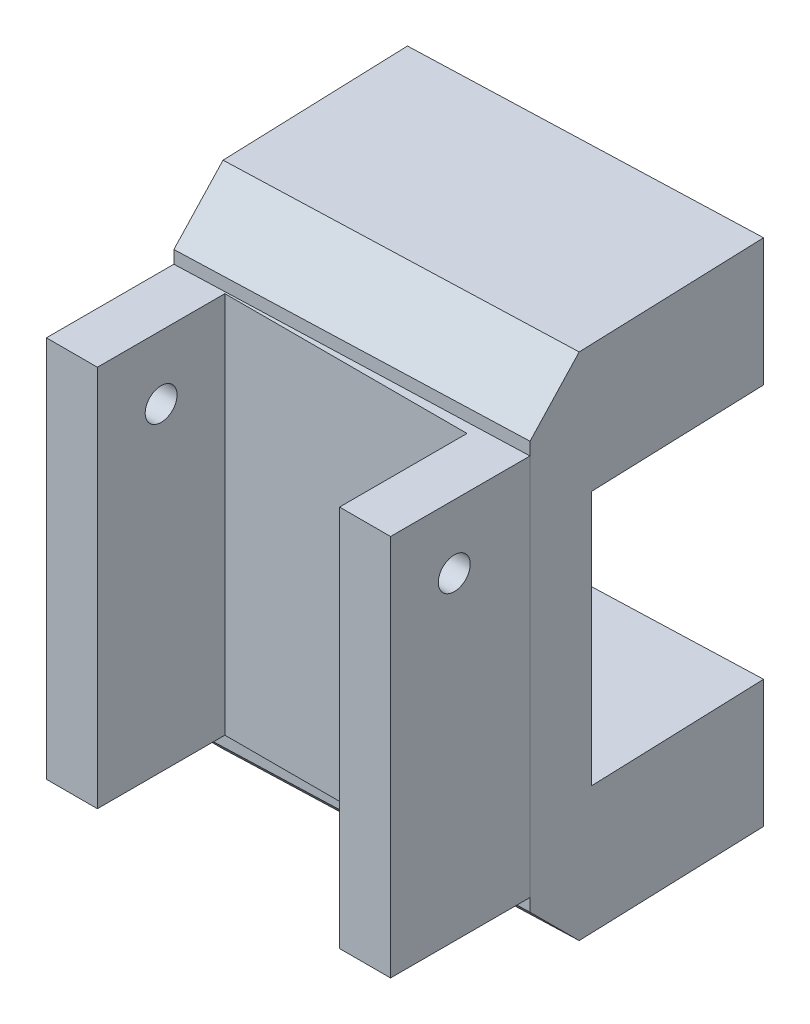
ISO-10303-21;
HEADER;
FILE_DESCRIPTION(('STEP AP214'),'2;1');
FILE_NAME('part.step','',(''),(''),'','','');
FILE_SCHEMA(('AUTOMOTIVE_DESIGN { 1 0 10303 214 1 1 1 1 }'));
ENDSEC;
DATA;
#1=APPLICATION_CONTEXT('core data for automotive mechanical design processes');
#2=APPLICATION_PROTOCOL_DEFINITION('international standard','automotive_design',2000,#1);
#3=PRODUCT_CONTEXT('',#1,'mechanical');
#4=PRODUCT('Part','Part','',(#3));
#5=PRODUCT_RELATED_PRODUCT_CATEGORY('part','',(#4));
#6=PRODUCT_DEFINITION_FORMATION('','',#4);
#7=PRODUCT_DEFINITION_CONTEXT('part definition',#1,'design');
#8=PRODUCT_DEFINITION('design','',#6,#7);
#9=PRODUCT_DEFINITION_SHAPE('','',#8);
#10=(LENGTH_UNIT() NAMED_UNIT(*) SI_UNIT(.MILLI.,.METRE.));
#11=(NAMED_UNIT(*) PLANE_ANGLE_UNIT() SI_UNIT($,.RADIAN.));
#12=(NAMED_UNIT(*) SI_UNIT($,.STERADIAN.) SOLID_ANGLE_UNIT());
#13=UNCERTAINTY_MEASURE_WITH_UNIT(LENGTH_MEASURE(1.E-05),#10,'distance_accuracy_value','');
#14=(GEOMETRIC_REPRESENTATION_CONTEXT(3) GLOBAL_UNCERTAINTY_ASSIGNED_CONTEXT((#13)) GLOBAL_UNIT_ASSIGNED_CONTEXT((#10,
#11,#12)) REPRESENTATION_CONTEXT('',''));
#15=CARTESIAN_POINT('',(0.,0.,0.));
#16=DIRECTION('',(0.,0.,1.));
#17=DIRECTION('',(1.,0.,0.));
#18=AXIS2_PLACEMENT_3D('',#15,#16,#17);
#19=CARTESIAN_POINT('',(8.46169409796958,9.525,-6.94678246872153));
#20=DIRECTION('',(0.0348994967024939,0.,0.999390827019096));
#21=DIRECTION('',(0.999390827019096,0.,-0.0348994967024939));
#22=AXIS2_PLACEMENT_3D('',#19,#20,#21);
#23=PLANE('',#22);
#24=DIRECTION('',(0.,-1.,0.));
#25=VECTOR('',#24,1.);
#26=CARTESIAN_POINT('',(8.46169409796958,9.525,-6.94678246872153));
#27=LINE('',#26,#25);
#28=CARTESIAN_POINT('',(8.46169409796958,6.35,-6.94678246872153));
#29=VERTEX_POINT('',#28);
#30=CARTESIAN_POINT('',(8.46169409796958,-6.35,-6.94678246872153));
#31=VERTEX_POINT('',#30);
#32=EDGE_CURVE('E605',#29,#31,#27,.T.);
#33=ORIENTED_EDGE('',*,*,#32,.T.);
#34=DIRECTION('',(-0.999390827019096,0.,0.0348994967024939));
#35=VECTOR('',#34,1.);
#36=CARTESIAN_POINT('',(8.46169409796958,-6.35,-6.94678246872153));
#37=LINE('',#36,#35);
#38=CARTESIAN_POINT('',(-8.68330590203042,-6.35,-6.34806587578563));
#39=VERTEX_POINT('',#38);
#40=EDGE_CURVE('E512',#31,#39,#37,.T.);
#41=ORIENTED_EDGE('',*,*,#40,.T.);
#42=DIRECTION('',(0.,-1.,0.));
#43=VECTOR('',#42,1.);
#44=CARTESIAN_POINT('',(-8.68330590203042,9.525,-6.34806587578563));
#45=LINE('',#44,#43);
#46=CARTESIAN_POINT('',(-8.68330590203042,6.35,-6.34806587578563));
#47=VERTEX_POINT('',#46);
#48=EDGE_CURVE('E630',#47,#39,#45,.T.);
#49=ORIENTED_EDGE('',*,*,#48,.F.);
#50=DIRECTION('',(0.999390827019096,0.,-0.0348994967024939));
#51=VECTOR('',#50,1.);
#52=CARTESIAN_POINT('',(8.46169409796958,6.35,-6.94678246872153));
#53=LINE('',#52,#51);
#54=EDGE_CURVE('E561',#47,#29,#53,.T.);
#55=ORIENTED_EDGE('',*,*,#54,.T.);
#56=EDGE_LOOP('',(#33,#41,#49,#55));
#57=FACE_BOUND('',#56,.T.);
#58=ADVANCED_FACE('F372',(#57),#23,.F.);
#59=CARTESIAN_POINT('',(-8.68330590203042,9.525,-6.34806587578563));
#60=DIRECTION('',(0.999390827019096,0.,-0.0348994967024937));
#61=DIRECTION('',(-0.0348994967024937,0.,-0.999390827019096));
#62=AXIS2_PLACEMENT_3D('',#59,#60,#61);
#63=PLANE('',#62);
#64=DIRECTION('',(0.0348994967024937,0.,0.999390827019096));
#65=VECTOR('',#64,1.);
#66=CARTESIAN_POINT('',(-8.99356242771559,-12.7,-15.2326503279854));
#67=LINE('',#66,#65);
#68=CARTESIAN_POINT('',(-8.99356242771559,-12.7,-15.2326503279854));
#69=VERTEX_POINT('',#68);
#70=CARTESIAN_POINT('',(-8.66114472162434,-12.7,-5.71345270062849));
#71=VERTEX_POINT('',#70);
#72=EDGE_CURVE('E671',#69,#71,#67,.T.);
#73=ORIENTED_EDGE('',*,*,#72,.T.);
#74=DIRECTION('',(-0.0246776707783308,-0.707106781186549,-0.706676030840833));
#75=VECTOR('',#74,1.);
#76=CARTESIAN_POINT('',(-8.5725,-10.16,-3.17499999999998));
#77=LINE('',#76,#75);
#78=CARTESIAN_POINT('',(-8.5725,-10.16,-3.17499999999999));
#79=VERTEX_POINT('',#78);
#80=EDGE_CURVE('E649',#71,#79,#77,.F.);
#81=ORIENTED_EDGE('',*,*,#80,.T.);
#82=DIRECTION('',(0.,1.,0.));
#83=VECTOR('',#82,1.);
#84=CARTESIAN_POINT('',(-8.5725,-6.35,-3.17499999999999));
#85=LINE('',#84,#83);
#86=CARTESIAN_POINT('',(-8.5725,-9.525,-3.175));
#87=VERTEX_POINT('',#86);
#88=EDGE_CURVE('E532',#79,#87,#85,.T.);
#89=ORIENTED_EDGE('',*,*,#88,.T.);
#90=DIRECTION('',(0.,-1.,0.));
#91=VECTOR('',#90,1.);
#92=CARTESIAN_POINT('',(-8.5725,9.525,-3.175));
#93=LINE('',#92,#91);
#94=CARTESIAN_POINT('',(-8.5725,9.525,-3.17499999999999));
#95=VERTEX_POINT('',#94);
#96=EDGE_CURVE('E627',#95,#87,#93,.T.);
#97=ORIENTED_EDGE('',*,*,#96,.F.);
#98=DIRECTION('',(0.,1.,0.));
#99=VECTOR('',#98,1.);
#100=CARTESIAN_POINT('',(-8.5725,12.7,-3.17499999999999));
#101=LINE('',#100,#99);
#102=CARTESIAN_POINT('',(-8.5725,10.16,-3.17499999999999));
#103=VERTEX_POINT('',#102);
#104=EDGE_CURVE('E538',#95,#103,#101,.T.);
#105=ORIENTED_EDGE('',*,*,#104,.T.);
#106=DIRECTION('',(0.0246776707783309,-0.707106781186547,0.706676030840836));
#107=VECTOR('',#106,1.);
#108=CARTESIAN_POINT('',(-8.66114472162434,12.7,-5.71345270062849));
#109=LINE('',#108,#107);
#110=CARTESIAN_POINT('',(-8.66114472162434,12.7,-5.7134527006285));
#111=VERTEX_POINT('',#110);
#112=EDGE_CURVE('E386',#103,#111,#109,.F.);
#113=ORIENTED_EDGE('',*,*,#112,.T.);
#114=DIRECTION('',(-0.0348994967024937,0.,-0.999390827019096));
#115=VECTOR('',#114,1.);
#116=CARTESIAN_POINT('',(-8.99356242771559,12.7,-15.2326503279854));
#117=LINE('',#116,#115);
#118=CARTESIAN_POINT('',(-8.99356242771559,12.7,-15.2326503279854));
#119=VERTEX_POINT('',#118);
#120=EDGE_CURVE('E546',#111,#119,#117,.T.);
#121=ORIENTED_EDGE('',*,*,#120,.T.);
#122=DIRECTION('',(0.,-1.,0.));
#123=VECTOR('',#122,1.);
#124=CARTESIAN_POINT('',(-8.99356242771559,12.7,-15.2326503279854));
#125=LINE('',#124,#123);
#126=CARTESIAN_POINT('',(-8.99356242771559,6.35,-15.2326503279854));
#127=VERTEX_POINT('',#126);
#128=EDGE_CURVE('E544',#119,#127,#125,.T.);
#129=ORIENTED_EDGE('',*,*,#128,.T.);
#130=DIRECTION('',(0.0348994967024937,0.,0.999390827019096));
#131=VECTOR('',#130,1.);
#132=CARTESIAN_POINT('',(-8.99356242771559,6.35,-15.2326503279854));
#133=LINE('',#132,#131);
#134=EDGE_CURVE('E540',#127,#47,#133,.T.);
#135=ORIENTED_EDGE('',*,*,#134,.T.);
#136=ORIENTED_EDGE('',*,*,#48,.T.);
#137=DIRECTION('',(-0.0348994967024937,0.,-0.999390827019096));
#138=VECTOR('',#137,1.);
#139=CARTESIAN_POINT('',(-8.99356242771559,-6.35,-15.2326503279854));
#140=LINE('',#139,#138);
#141=CARTESIAN_POINT('',(-8.99356242771559,-6.35,-15.2326503279854));
#142=VERTEX_POINT('',#141);
#143=EDGE_CURVE('E534',#39,#142,#140,.T.);
#144=ORIENTED_EDGE('',*,*,#143,.T.);
#145=DIRECTION('',(0.,-1.,0.));
#146=VECTOR('',#145,1.);
#147=CARTESIAN_POINT('',(-8.99356242771559,-6.35,-15.2326503279854));
#148=LINE('',#147,#146);
#149=EDGE_CURVE('E503',#142,#69,#148,.T.);
#150=ORIENTED_EDGE('',*,*,#149,.T.);
#151=EDGE_LOOP('',(#73,#81,#89,#97,#105,#113,#121,#129,#135,#136,#144,#150));
#152=FACE_BOUND('',#151,.T.);
#153=ADVANCED_FACE('F665',(#152),#63,.F.);
#154=CARTESIAN_POINT('',(-8.5725,9.525,-3.175));
#155=DIRECTION('',(1.,0.,0.));
#156=DIRECTION('',(0.,0.,-1.));
#157=AXIS2_PLACEMENT_3D('',#154,#155,#156);
#158=PLANE('',#157);
#159=CARTESIAN_POINT('',(-8.5725,6.35,0.));
#160=DIRECTION('',(-1.,0.,0.));
#161=DIRECTION('',(0.,0.,1.));
#162=AXIS2_PLACEMENT_3D('',#159,#160,#161);
#163=CIRCLE('',#162,0.79375);
#164=CARTESIAN_POINT('',(-8.5725,6.35,0.793750000000003));
#165=VERTEX_POINT('',#164);
#166=EDGE_CURVE('E563',#165,#165,#163,.T.);
#167=ORIENTED_EDGE('',*,*,#166,.F.);
#168=EDGE_LOOP('',(#167));
#169=FACE_BOUND('',#168,.T.);
#170=DIRECTION('',(0.,0.,1.));
#171=VECTOR('',#170,1.);
#172=CARTESIAN_POINT('',(-8.5725,-9.525,-3.175));
#173=LINE('',#172,#171);
#174=CARTESIAN_POINT('',(-8.5725,-9.525,3.175));
#175=VERTEX_POINT('',#174);
#176=EDGE_CURVE('E575',#87,#175,#173,.T.);
#177=ORIENTED_EDGE('',*,*,#176,.T.);
#178=DIRECTION('',(0.,-1.,0.));
#179=VECTOR('',#178,1.);
#180=CARTESIAN_POINT('',(-8.5725,9.525,3.175));
#181=LINE('',#180,#179);
#182=CARTESIAN_POINT('',(-8.5725,9.525,3.175));
#183=VERTEX_POINT('',#182);
#184=EDGE_CURVE('E624',#183,#175,#181,.T.);
#185=ORIENTED_EDGE('',*,*,#184,.F.);
#186=DIRECTION('',(0.,0.,1.));
#187=VECTOR('',#186,1.);
#188=CARTESIAN_POINT('',(-8.5725,9.525,-3.175));
#189=LINE('',#188,#187);
#190=EDGE_CURVE('E590',#95,#183,#189,.T.);
#191=ORIENTED_EDGE('',*,*,#190,.F.);
#192=ORIENTED_EDGE('',*,*,#96,.T.);
#193=EDGE_LOOP('',(#177,#185,#191,#192));
#194=FACE_BOUND('',#193,.T.);
#195=ADVANCED_FACE('F729',(#169,#194),#158,.F.);
#196=CARTESIAN_POINT('',(-8.5725,9.525,3.175));
#197=DIRECTION('',(0.,0.,-1.));
#198=DIRECTION('',(-1.,0.,0.));
#199=AXIS2_PLACEMENT_3D('',#196,#197,#198);
#200=PLANE('',#199);
#201=DIRECTION('',(1.,0.,0.));
#202=VECTOR('',#201,1.);
#203=CARTESIAN_POINT('',(-8.5725,-9.525,3.175));
#204=LINE('',#203,#202);
#205=CARTESIAN_POINT('',(-6.0325,-9.525,3.175));
#206=VERTEX_POINT('',#205);
#207=EDGE_CURVE('E577',#175,#206,#204,.T.);
#208=ORIENTED_EDGE('',*,*,#207,.T.);
#209=DIRECTION('',(0.,-1.,0.));
#210=VECTOR('',#209,1.);
#211=CARTESIAN_POINT('',(-6.0325,9.525,3.175));
#212=LINE('',#211,#210);
#213=CARTESIAN_POINT('',(-6.0325,9.525,3.175));
#214=VERTEX_POINT('',#213);
#215=EDGE_CURVE('E621',#214,#206,#212,.T.);
#216=ORIENTED_EDGE('',*,*,#215,.F.);
#217=DIRECTION('',(1.,0.,0.));
#218=VECTOR('',#217,1.);
#219=CARTESIAN_POINT('',(-8.5725,9.525,3.175));
#220=LINE('',#219,#218);
#221=EDGE_CURVE('E592',#183,#214,#220,.T.);
#222=ORIENTED_EDGE('',*,*,#221,.F.);
#223=ORIENTED_EDGE('',*,*,#184,.T.);
#224=EDGE_LOOP('',(#208,#216,#222,#223));
#225=FACE_BOUND('',#224,.T.);
#226=ADVANCED_FACE('F734',(#225),#200,.F.);
#227=CARTESIAN_POINT('',(-6.0325,9.525,3.175));
#228=DIRECTION('',(-1.,0.,0.));
#229=DIRECTION('',(0.,0.,1.));
#230=AXIS2_PLACEMENT_3D('',#227,#228,#229);
#231=PLANE('',#230);
#232=CARTESIAN_POINT('',(-6.0325,6.35,0.));
#233=DIRECTION('',(-1.,0.,0.));
#234=DIRECTION('',(0.,0.,1.));
#235=AXIS2_PLACEMENT_3D('',#232,#233,#234);
#236=CIRCLE('',#235,0.79375);
#237=CARTESIAN_POINT('',(-6.0325,6.35,0.793750000000003));
#238=VERTEX_POINT('',#237);
#239=EDGE_CURVE('E572',#238,#238,#236,.T.);
#240=ORIENTED_EDGE('',*,*,#239,.T.);
#241=EDGE_LOOP('',(#240));
#242=FACE_BOUND('',#241,.T.);
#243=DIRECTION('',(0.,0.,-1.));
#244=VECTOR('',#243,1.);
#245=CARTESIAN_POINT('',(-6.0325,-9.525,3.175));
#246=LINE('',#245,#244);
#247=CARTESIAN_POINT('',(-6.0325,-9.525,-3.175));
#248=VERTEX_POINT('',#247);
#249=EDGE_CURVE('E579',#206,#248,#246,.T.);
#250=ORIENTED_EDGE('',*,*,#249,.T.);
#251=DIRECTION('',(0.,-1.,0.));
#252=VECTOR('',#251,1.);
#253=CARTESIAN_POINT('',(-6.0325,9.525,-3.175));
#254=LINE('',#253,#252);
#255=CARTESIAN_POINT('',(-6.0325,9.525,-3.175));
#256=VERTEX_POINT('',#255);
#257=EDGE_CURVE('E618',#256,#248,#254,.T.);
#258=ORIENTED_EDGE('',*,*,#257,.F.);
#259=DIRECTION('',(0.,0.,-1.));
#260=VECTOR('',#259,1.);
#261=CARTESIAN_POINT('',(-6.0325,9.525,3.175));
#262=LINE('',#261,#260);
#263=EDGE_CURVE('E594',#214,#256,#262,.T.);
#264=ORIENTED_EDGE('',*,*,#263,.F.);
#265=ORIENTED_EDGE('',*,*,#215,.T.);
#266=EDGE_LOOP('',(#250,#258,#264,#265));
#267=FACE_BOUND('',#266,.T.);
#268=ADVANCED_FACE('F740',(#242,#267),#231,.F.);
#269=CARTESIAN_POINT('',(-6.0325,9.525,-3.175));
#270=DIRECTION('',(0.,0.,-1.));
#271=DIRECTION('',(-1.,0.,0.));
#272=AXIS2_PLACEMENT_3D('',#269,#270,#271);
#273=PLANE('',#272);
#274=DIRECTION('',(1.,0.,0.));
#275=VECTOR('',#274,1.);
#276=CARTESIAN_POINT('',(-6.0325,-9.525,-3.175));
#277=LINE('',#276,#275);
#278=CARTESIAN_POINT('',(6.0325,-9.525,-3.175));
#279=VERTEX_POINT('',#278);
#280=EDGE_CURVE('E581',#248,#279,#277,.T.);
#281=ORIENTED_EDGE('',*,*,#280,.T.);
#282=DIRECTION('',(0.,-1.,0.));
#283=VECTOR('',#282,1.);
#284=CARTESIAN_POINT('',(6.0325,9.525,-3.175));
#285=LINE('',#284,#283);
#286=CARTESIAN_POINT('',(6.0325,9.525,-3.175));
#287=VERTEX_POINT('',#286);
#288=EDGE_CURVE('E615',#287,#279,#285,.T.);
#289=ORIENTED_EDGE('',*,*,#288,.F.);
#290=DIRECTION('',(1.,0.,0.));
#291=VECTOR('',#290,1.);
#292=CARTESIAN_POINT('',(-6.0325,9.525,-3.175));
#293=LINE('',#292,#291);
#294=EDGE_CURVE('E596',#256,#287,#293,.T.);
#295=ORIENTED_EDGE('',*,*,#294,.F.);
#296=ORIENTED_EDGE('',*,*,#257,.T.);
#297=EDGE_LOOP('',(#281,#289,#295,#296));
#298=FACE_BOUND('',#297,.T.);
#299=ADVANCED_FACE('F744',(#298),#273,.F.);
#300=CARTESIAN_POINT('',(6.0325,9.525,-3.175));
#301=DIRECTION('',(1.,0.,0.));
#302=DIRECTION('',(0.,0.,-1.));
#303=AXIS2_PLACEMENT_3D('',#300,#301,#302);
#304=PLANE('',#303);
#305=CARTESIAN_POINT('',(6.0325,6.35,0.));
#306=DIRECTION('',(1.,0.,0.));
#307=DIRECTION('',(0.,0.,-1.));
#308=AXIS2_PLACEMENT_3D('',#305,#306,#307);
#309=CIRCLE('',#308,0.79375);
#310=CARTESIAN_POINT('',(6.0325,6.35,-0.793749999999993));
#311=VERTEX_POINT('',#310);
#312=EDGE_CURVE('E569',#311,#311,#309,.T.);
#313=ORIENTED_EDGE('',*,*,#312,.T.);
#314=EDGE_LOOP('',(#313));
#315=FACE_BOUND('',#314,.T.);
#316=DIRECTION('',(0.,0.,1.));
#317=VECTOR('',#316,1.);
#318=CARTESIAN_POINT('',(6.0325,-9.525,-3.175));
#319=LINE('',#318,#317);
#320=CARTESIAN_POINT('',(6.0325,-9.525,3.175));
#321=VERTEX_POINT('',#320);
#322=EDGE_CURVE('E583',#279,#321,#319,.T.);
#323=ORIENTED_EDGE('',*,*,#322,.T.);
#324=DIRECTION('',(0.,-1.,0.));
#325=VECTOR('',#324,1.);
#326=CARTESIAN_POINT('',(6.0325,9.525,3.175));
#327=LINE('',#326,#325);
#328=CARTESIAN_POINT('',(6.0325,9.525,3.175));
#329=VERTEX_POINT('',#328);
#330=EDGE_CURVE('E612',#329,#321,#327,.T.);
#331=ORIENTED_EDGE('',*,*,#330,.F.);
#332=DIRECTION('',(0.,0.,1.));
#333=VECTOR('',#332,1.);
#334=CARTESIAN_POINT('',(6.0325,9.525,-3.175));
#335=LINE('',#334,#333);
#336=EDGE_CURVE('E598',#287,#329,#335,.T.);
#337=ORIENTED_EDGE('',*,*,#336,.F.);
#338=ORIENTED_EDGE('',*,*,#288,.T.);
#339=EDGE_LOOP('',(#323,#331,#337,#338));
#340=FACE_BOUND('',#339,.T.);
#341=ADVANCED_FACE('F748',(#315,#340),#304,.F.);
#342=CARTESIAN_POINT('',(6.0325,9.525,3.175));
#343=DIRECTION('',(0.,0.,-1.));
#344=DIRECTION('',(-1.,0.,0.));
#345=AXIS2_PLACEMENT_3D('',#342,#343,#344);
#346=PLANE('',#345);
#347=DIRECTION('',(1.,0.,0.));
#348=VECTOR('',#347,1.);
#349=CARTESIAN_POINT('',(6.0325,-9.525,3.175));
#350=LINE('',#349,#348);
#351=CARTESIAN_POINT('',(8.5725,-9.525,3.175));
#352=VERTEX_POINT('',#351);
#353=EDGE_CURVE('E585',#321,#352,#350,.T.);
#354=ORIENTED_EDGE('',*,*,#353,.T.);
#355=DIRECTION('',(0.,-1.,0.));
#356=VECTOR('',#355,1.);
#357=CARTESIAN_POINT('',(8.5725,9.525,3.175));
#358=LINE('',#357,#356);
#359=CARTESIAN_POINT('',(8.5725,9.525,3.175));
#360=VERTEX_POINT('',#359);
#361=EDGE_CURVE('E609',#360,#352,#358,.T.);
#362=ORIENTED_EDGE('',*,*,#361,.F.);
#363=DIRECTION('',(1.,0.,0.));
#364=VECTOR('',#363,1.);
#365=CARTESIAN_POINT('',(6.0325,9.525,3.175));
#366=LINE('',#365,#364);
#367=EDGE_CURVE('E600',#329,#360,#366,.T.);
#368=ORIENTED_EDGE('',*,*,#367,.F.);
#369=ORIENTED_EDGE('',*,*,#330,.T.);
#370=EDGE_LOOP('',(#354,#362,#368,#369));
#371=FACE_BOUND('',#370,.T.);
#372=ADVANCED_FACE('F752',(#371),#346,.F.);
#373=CARTESIAN_POINT('',(8.5725,9.525,3.175));
#374=DIRECTION('',(-1.,0.,0.));
#375=DIRECTION('',(0.,0.,1.));
#376=AXIS2_PLACEMENT_3D('',#373,#374,#375);
#377=PLANE('',#376);
#378=CARTESIAN_POINT('',(8.5725,6.35,0.));
#379=DIRECTION('',(-1.,0.,0.));
#380=DIRECTION('',(0.,0.,1.));
#381=AXIS2_PLACEMENT_3D('',#378,#379,#380);
#382=CIRCLE('',#381,0.79375);
#383=CARTESIAN_POINT('',(8.5725,6.35,0.793750000000008));
#384=VERTEX_POINT('',#383);
#385=EDGE_CURVE('E566',#384,#384,#382,.T.);
#386=ORIENTED_EDGE('',*,*,#385,.T.);
#387=EDGE_LOOP('',(#386));
#388=FACE_BOUND('',#387,.T.);
#389=DIRECTION('',(0.,0.,-1.));
#390=VECTOR('',#389,1.);
#391=CARTESIAN_POINT('',(8.5725,-9.525,3.175));
#392=LINE('',#391,#390);
#393=CARTESIAN_POINT('',(8.5725,-9.525,-3.7737165929359));
#394=VERTEX_POINT('',#393);
#395=EDGE_CURVE('E587',#352,#394,#392,.T.);
#396=ORIENTED_EDGE('',*,*,#395,.T.);
#397=DIRECTION('',(0.,-1.,0.));
#398=VECTOR('',#397,1.);
#399=CARTESIAN_POINT('',(8.5725,9.525,-3.77371659293589));
#400=LINE('',#399,#398);
#401=CARTESIAN_POINT('',(8.5725,9.525,-3.77371659293589));
#402=VERTEX_POINT('',#401);
#403=EDGE_CURVE('E607',#402,#394,#400,.T.);
#404=ORIENTED_EDGE('',*,*,#403,.F.);
#405=DIRECTION('',(0.,0.,-1.));
#406=VECTOR('',#405,1.);
#407=CARTESIAN_POINT('',(8.5725,9.525,3.175));
#408=LINE('',#407,#406);
#409=EDGE_CURVE('E602',#360,#402,#408,.T.);
#410=ORIENTED_EDGE('',*,*,#409,.F.);
#411=ORIENTED_EDGE('',*,*,#361,.T.);
#412=EDGE_LOOP('',(#396,#404,#410,#411));
#413=FACE_BOUND('',#412,.T.);
#414=ADVANCED_FACE('F756',(#388,#413),#377,.F.);
#415=CARTESIAN_POINT('',(8.5725,9.525,-3.77371659293589));
#416=DIRECTION('',(-0.999390827019096,0.,0.0348994967024948));
#417=DIRECTION('',(0.0348994967024948,0.,0.999390827019096));
#418=AXIS2_PLACEMENT_3D('',#415,#416,#417);
#419=PLANE('',#418);
#420=DIRECTION('',(0.,-1.,0.));
#421=VECTOR('',#420,1.);
#422=CARTESIAN_POINT('',(8.5725,-6.35,-3.7737165929359));
#423=LINE('',#422,#421);
#424=CARTESIAN_POINT('',(8.5725,-10.16,-3.7737165929359));
#425=VERTEX_POINT('',#424);
#426=EDGE_CURVE('E516',#394,#425,#423,.T.);
#427=ORIENTED_EDGE('',*,*,#426,.T.);
#428=DIRECTION('',(0.0246776707783316,0.707106781186549,0.706676030840833));
#429=VECTOR('',#428,1.);
#430=CARTESIAN_POINT('',(8.5725,-10.16,-3.7737165929359));
#431=LINE('',#430,#429);
#432=CARTESIAN_POINT('',(8.48385527837566,-12.7,-6.3121692935644));
#433=VERTEX_POINT('',#432);
#434=EDGE_CURVE('E644',#425,#433,#431,.F.);
#435=ORIENTED_EDGE('',*,*,#434,.T.);
#436=DIRECTION('',(-0.0348994967024947,0.,-0.999390827019096));
#437=VECTOR('',#436,1.);
#438=CARTESIAN_POINT('',(8.1514375722844,-12.7,-15.8313669209213));
#439=LINE('',#438,#437);
#440=CARTESIAN_POINT('',(8.1514375722844,-12.7,-15.8313669209213));
#441=VERTEX_POINT('',#440);
#442=EDGE_CURVE('E506',#433,#441,#439,.T.);
#443=ORIENTED_EDGE('',*,*,#442,.T.);
#444=DIRECTION('',(0.,1.,0.));
#445=VECTOR('',#444,1.);
#446=CARTESIAN_POINT('',(8.1514375722844,-6.35,-15.8313669209213));
#447=LINE('',#446,#445);
#448=CARTESIAN_POINT('',(8.1514375722844,-6.35,-15.8313669209213));
#449=VERTEX_POINT('',#448);
#450=EDGE_CURVE('E502',#441,#449,#447,.T.);
#451=ORIENTED_EDGE('',*,*,#450,.T.);
#452=DIRECTION('',(0.0348994967024947,0.,0.999390827019096));
#453=VECTOR('',#452,1.);
#454=CARTESIAN_POINT('',(8.1514375722844,-6.35,-15.8313669209213));
#455=LINE('',#454,#453);
#456=EDGE_CURVE('E509',#449,#31,#455,.T.);
#457=ORIENTED_EDGE('',*,*,#456,.T.);
#458=ORIENTED_EDGE('',*,*,#32,.F.);
#459=DIRECTION('',(-0.0348994967024948,0.,-0.999390827019096));
#460=VECTOR('',#459,1.);
#461=CARTESIAN_POINT('',(8.1514375722844,6.35,-15.8313669209213));
#462=LINE('',#461,#460);
#463=CARTESIAN_POINT('',(8.1514375722844,6.35,-15.8313669209213));
#464=VERTEX_POINT('',#463);
#465=EDGE_CURVE('E554',#29,#464,#462,.T.);
#466=ORIENTED_EDGE('',*,*,#465,.T.);
#467=DIRECTION('',(0.,1.,0.));
#468=VECTOR('',#467,1.);
#469=CARTESIAN_POINT('',(8.1514375722844,12.7,-15.8313669209213));
#470=LINE('',#469,#468);
#471=CARTESIAN_POINT('',(8.1514375722844,12.7,-15.8313669209213));
#472=VERTEX_POINT('',#471);
#473=EDGE_CURVE('E537',#464,#472,#470,.T.);
#474=ORIENTED_EDGE('',*,*,#473,.T.);
#475=DIRECTION('',(0.0348994967024948,0.,0.999390827019096));
#476=VECTOR('',#475,1.);
#477=CARTESIAN_POINT('',(8.1514375722844,12.7,-15.8313669209213));
#478=LINE('',#477,#476);
#479=CARTESIAN_POINT('',(8.48385527837566,12.7,-6.31216929356441));
#480=VERTEX_POINT('',#479);
#481=EDGE_CURVE('E549',#472,#480,#478,.T.);
#482=ORIENTED_EDGE('',*,*,#481,.T.);
#483=DIRECTION('',(-0.0246776707783317,0.707106781186547,-0.706676030840836));
#484=VECTOR('',#483,1.);
#485=CARTESIAN_POINT('',(8.48385527837566,12.7,-6.31216929356441));
#486=LINE('',#485,#484);
#487=CARTESIAN_POINT('',(8.5725,10.16,-3.7737165929359));
#488=VERTEX_POINT('',#487);
#489=EDGE_CURVE('E642',#480,#488,#486,.F.);
#490=ORIENTED_EDGE('',*,*,#489,.T.);
#491=DIRECTION('',(0.,-1.,0.));
#492=VECTOR('',#491,1.);
#493=CARTESIAN_POINT('',(8.5725,12.7,-3.7737165929359));
#494=LINE('',#493,#492);
#495=EDGE_CURVE('E552',#488,#402,#494,.T.);
#496=ORIENTED_EDGE('',*,*,#495,.T.);
#497=ORIENTED_EDGE('',*,*,#403,.T.);
#498=EDGE_LOOP('',(#427,#435,#443,#451,#457,#458,#466,#474,#482,#490,#496,#497));
#499=FACE_BOUND('',#498,.T.);
#500=ADVANCED_FACE('F519',(#499),#419,.F.);
#501=CARTESIAN_POINT('',(-8.68330590203042,9.525,-6.34806587578563));
#502=DIRECTION('',(0.,1.,0.));
#503=DIRECTION('',(0.,0.,1.));
#504=AXIS2_PLACEMENT_3D('',#501,#502,#503);
#505=PLANE('',#504);
#506=DIRECTION('',(0.999390827019096,0.,-0.0348994967024948));
#507=VECTOR('',#506,1.);
#508=CARTESIAN_POINT('',(-8.5725,9.525,-3.17499999999999));
#509=LINE('',#508,#507);
#510=EDGE_CURVE('E633',#95,#402,#509,.T.);
#511=ORIENTED_EDGE('',*,*,#510,.F.);
#512=ORIENTED_EDGE('',*,*,#190,.T.);
#513=ORIENTED_EDGE('',*,*,#221,.T.);
#514=ORIENTED_EDGE('',*,*,#263,.T.);
#515=ORIENTED_EDGE('',*,*,#294,.T.);
#516=ORIENTED_EDGE('',*,*,#336,.T.);
#517=ORIENTED_EDGE('',*,*,#367,.T.);
#518=ORIENTED_EDGE('',*,*,#409,.T.);
#519=EDGE_LOOP('',(#511,#512,#513,#514,#515,#516,#517,#518));
#520=FACE_BOUND('',#519,.T.);
#521=ADVANCED_FACE('F762',(#520),#505,.T.);
#522=CARTESIAN_POINT('',(-8.68330590203042,-9.525,-6.34806587578563));
#523=DIRECTION('',(0.,1.,0.));
#524=DIRECTION('',(0.,0.,1.));
#525=AXIS2_PLACEMENT_3D('',#522,#523,#524);
#526=PLANE('',#525);
#527=ORIENTED_EDGE('',*,*,#176,.F.);
#528=DIRECTION('',(0.999390827019096,0.,-0.0348994967024948));
#529=VECTOR('',#528,1.);
#530=CARTESIAN_POINT('',(-8.5725,-9.525,-3.17499999999999));
#531=LINE('',#530,#529);
#532=EDGE_CURVE('E636',#87,#394,#531,.T.);
#533=ORIENTED_EDGE('',*,*,#532,.T.);
#534=ORIENTED_EDGE('',*,*,#395,.F.);
#535=ORIENTED_EDGE('',*,*,#353,.F.);
#536=ORIENTED_EDGE('',*,*,#322,.F.);
#537=ORIENTED_EDGE('',*,*,#280,.F.);
#538=ORIENTED_EDGE('',*,*,#249,.F.);
#539=ORIENTED_EDGE('',*,*,#207,.F.);
#540=EDGE_LOOP('',(#527,#533,#534,#535,#536,#537,#538,#539));
#541=FACE_BOUND('',#540,.T.);
#542=ADVANCED_FACE('F765',(#541),#526,.F.);
#543=CARTESIAN_POINT('',(8.5725,6.35,0.));
#544=DIRECTION('',(-1.,0.,0.));
#545=DIRECTION('',(0.,0.,1.));
#546=AXIS2_PLACEMENT_3D('',#543,#544,#545);
#547=CYLINDRICAL_SURFACE('',#546,0.79375);
#548=ORIENTED_EDGE('',*,*,#385,.F.);
#549=EDGE_LOOP('',(#548));
#550=FACE_BOUND('',#549,.T.);
#551=ORIENTED_EDGE('',*,*,#312,.F.);
#552=EDGE_LOOP('',(#551));
#553=FACE_BOUND('',#552,.T.);
#554=ADVANCED_FACE('F769',(#550,#553),#547,.F.);
#555=ORIENTED_EDGE('',*,*,#166,.T.);
#556=EDGE_LOOP('',(#555));
#557=FACE_BOUND('',#556,.T.);
#558=ORIENTED_EDGE('',*,*,#239,.F.);
#559=EDGE_LOOP('',(#558));
#560=FACE_BOUND('',#559,.T.);
#561=ADVANCED_FACE('F771',(#557,#560),#547,.F.);
#562=CARTESIAN_POINT('',(-22.6192851476401,6.35,-14.7568296057245));
#563=DIRECTION('',(0.,-1.,0.));
#564=DIRECTION('',(0.,0.,-1.));
#565=AXIS2_PLACEMENT_3D('',#562,#563,#564);
#566=PLANE('',#565);
#567=ORIENTED_EDGE('',*,*,#54,.F.);
#568=ORIENTED_EDGE('',*,*,#134,.F.);
#569=DIRECTION('',(0.999390827019096,0.,-0.0348994967024948));
#570=VECTOR('',#569,1.);
#571=CARTESIAN_POINT('',(-22.6192851476401,6.35,-14.7568296057245));
#572=LINE('',#571,#570);
#573=EDGE_CURVE('E541',#127,#464,#572,.T.);
#574=ORIENTED_EDGE('',*,*,#573,.T.);
#575=ORIENTED_EDGE('',*,*,#465,.F.);
#576=EDGE_LOOP('',(#567,#568,#574,#575));
#577=FACE_BOUND('',#576,.T.);
#578=ADVANCED_FACE('F668',(#577),#566,.T.);
#579=CARTESIAN_POINT('',(-22.6192851476401,12.7,-14.7568296057245));
#580=DIRECTION('',(-0.0348994967024948,0.,-0.999390827019096));
#581=DIRECTION('',(-0.999390827019096,0.,0.0348994967024948));
#582=AXIS2_PLACEMENT_3D('',#579,#580,#581);
#583=PLANE('',#582);
#584=CARTESIAN_POINT('',(-5.30184073303665,9.525,-15.3615680903129));
#585=DIRECTION('',(-0.0348994967024948,0.,-0.999390827019096));
#586=DIRECTION('',(-0.999390827019096,0.,0.0348994967024948));
#587=AXIS2_PLACEMENT_3D('',#584,#585,#586);
#588=CIRCLE('',#587,1.35255);
#589=CARTESIAN_POINT('',(-6.65356679612133,9.525,-15.314364776048));
#590=VERTEX_POINT('',#589);
#591=EDGE_CURVE('E683',#590,#590,#588,.T.);
#592=ORIENTED_EDGE('',*,*,#591,.F.);
#593=EDGE_LOOP('',(#592));
#594=FACE_BOUND('',#593,.T.);
#595=CARTESIAN_POINT('',(4.21735689432024,9.525,-15.6939857964042));
#596=DIRECTION('',(-0.0348994967024948,0.,-0.999390827019096));
#597=DIRECTION('',(-0.999390827019096,0.,0.0348994967024948));
#598=AXIS2_PLACEMENT_3D('',#595,#596,#597);
#599=CIRCLE('',#598,1.35255);
#600=CARTESIAN_POINT('',(2.86563083123556,9.525,-15.6467824821392));
#601=VERTEX_POINT('',#600);
#602=EDGE_CURVE('E525',#601,#601,#599,.T.);
#603=ORIENTED_EDGE('',*,*,#602,.F.);
#604=EDGE_LOOP('',(#603));
#605=FACE_BOUND('',#604,.T.);
#606=ORIENTED_EDGE('',*,*,#128,.F.);
#607=DIRECTION('',(0.999390827019096,0.,-0.0348994967024948));
#608=VECTOR('',#607,1.);
#609=CARTESIAN_POINT('',(-22.6192851476401,12.7,-14.7568296057245));
#610=LINE('',#609,#608);
#611=EDGE_CURVE('E556',#119,#472,#610,.T.);
#612=ORIENTED_EDGE('',*,*,#611,.T.);
#613=ORIENTED_EDGE('',*,*,#473,.F.);
#614=ORIENTED_EDGE('',*,*,#573,.F.);
#615=EDGE_LOOP('',(#606,#612,#613,#614));
#616=FACE_BOUND('',#615,.T.);
#617=ADVANCED_FACE('F662',(#594,#605,#616),#583,.T.);
#618=CARTESIAN_POINT('',(-22.1982227199245,12.7,-2.69917927773912));
#619=DIRECTION('',(0.0348994967024948,0.,0.999390827019096));
#620=DIRECTION('',(0.999390827019096,0.,-0.0348994967024948));
#621=AXIS2_PLACEMENT_3D('',#618,#619,#620);
#622=PLANE('',#621);
#623=ORIENTED_EDGE('',*,*,#495,.F.);
#624=DIRECTION('',(-0.999390827019096,0.,0.0348994967024948));
#625=VECTOR('',#624,1.);
#626=CARTESIAN_POINT('',(-22.1982227199245,10.16,-2.69917927773912));
#627=LINE('',#626,#625);
#628=EDGE_CURVE('E11',#488,#103,#627,.T.);
#629=ORIENTED_EDGE('',*,*,#628,.T.);
#630=ORIENTED_EDGE('',*,*,#104,.F.);
#631=ORIENTED_EDGE('',*,*,#510,.T.);
#632=EDGE_LOOP('',(#623,#629,#630,#631));
#633=FACE_BOUND('',#632,.T.);
#634=ADVANCED_FACE('F776',(#633),#622,.T.);
#635=CARTESIAN_POINT('',(-22.6192851476401,12.7,-14.7568296057245));
#636=DIRECTION('',(0.,1.,0.));
#637=DIRECTION('',(0.,0.,1.));
#638=AXIS2_PLACEMENT_3D('',#635,#636,#637);
#639=PLANE('',#638);
#640=ORIENTED_EDGE('',*,*,#120,.F.);
#641=DIRECTION('',(0.999390827019096,0.,-0.0348994967024948));
#642=VECTOR('',#641,1.);
#643=CARTESIAN_POINT('',(-22.2868674415488,12.7,-5.23763197836763));
#644=LINE('',#643,#642);
#645=EDGE_CURVE('E379',#111,#480,#644,.T.);
#646=ORIENTED_EDGE('',*,*,#645,.T.);
#647=ORIENTED_EDGE('',*,*,#481,.F.);
#648=ORIENTED_EDGE('',*,*,#611,.F.);
#649=EDGE_LOOP('',(#640,#646,#647,#648));
#650=FACE_BOUND('',#649,.T.);
#651=ADVANCED_FACE('F654',(#650),#639,.T.);
#652=CARTESIAN_POINT('',(-22.6192851476401,-6.35,-14.7568296057245));
#653=DIRECTION('',(0.,1.,0.));
#654=DIRECTION('',(0.,0.,1.));
#655=AXIS2_PLACEMENT_3D('',#652,#653,#654);
#656=PLANE('',#655);
#657=ORIENTED_EDGE('',*,*,#40,.F.);
#658=ORIENTED_EDGE('',*,*,#456,.F.);
#659=DIRECTION('',(0.999390827019096,0.,-0.0348994967024948));
#660=VECTOR('',#659,1.);
#661=CARTESIAN_POINT('',(-22.6192851476401,-6.35,-14.7568296057245));
#662=LINE('',#661,#660);
#663=EDGE_CURVE('E497',#142,#449,#662,.T.);
#664=ORIENTED_EDGE('',*,*,#663,.F.);
#665=ORIENTED_EDGE('',*,*,#143,.F.);
#666=EDGE_LOOP('',(#657,#658,#664,#665));
#667=FACE_BOUND('',#666,.T.);
#668=ADVANCED_FACE('F510',(#667),#656,.T.);
#669=CARTESIAN_POINT('',(-22.1982227199245,-6.35,-2.69917927773912));
#670=DIRECTION('',(0.0348994967024948,0.,0.999390827019096));
#671=DIRECTION('',(0.999390827019096,0.,-0.0348994967024948));
#672=AXIS2_PLACEMENT_3D('',#669,#670,#671);
#673=PLANE('',#672);
#674=ORIENTED_EDGE('',*,*,#88,.F.);
#675=DIRECTION('',(0.999390827019096,0.,-0.0348994967024948));
#676=VECTOR('',#675,1.);
#677=CARTESIAN_POINT('',(-22.1982227199245,-10.16,-2.69917927773912));
#678=LINE('',#677,#676);
#679=EDGE_CURVE('E639',#79,#425,#678,.T.);
#680=ORIENTED_EDGE('',*,*,#679,.T.);
#681=ORIENTED_EDGE('',*,*,#426,.F.);
#682=ORIENTED_EDGE('',*,*,#532,.F.);
#683=EDGE_LOOP('',(#674,#680,#681,#682));
#684=FACE_BOUND('',#683,.T.);
#685=ADVANCED_FACE('F703',(#684),#673,.T.);
#686=CARTESIAN_POINT('',(-22.6192851476401,-6.35,-14.7568296057245));
#687=DIRECTION('',(-0.0348994967024948,0.,-0.999390827019096));
#688=DIRECTION('',(-0.999390827019096,0.,0.0348994967024948));
#689=AXIS2_PLACEMENT_3D('',#686,#687,#688);
#690=PLANE('',#689);
#691=CARTESIAN_POINT('',(-5.30184073303665,-9.525,-15.3615680903129));
#692=DIRECTION('',(-0.0348994967024948,0.,-0.999390827019096));
#693=DIRECTION('',(-0.999390827019096,0.,0.0348994967024948));
#694=AXIS2_PLACEMENT_3D('',#691,#692,#693);
#695=CIRCLE('',#694,1.35255);
#696=CARTESIAN_POINT('',(-6.65356679612133,-9.525,-15.314364776048));
#697=VERTEX_POINT('',#696);
#698=EDGE_CURVE('E695',#697,#697,#695,.T.);
#699=ORIENTED_EDGE('',*,*,#698,.F.);
#700=EDGE_LOOP('',(#699));
#701=FACE_BOUND('',#700,.T.);
#702=CARTESIAN_POINT('',(4.21735689432024,-9.525,-15.6939857964042));
#703=DIRECTION('',(-0.0348994967024948,0.,-0.999390827019096));
#704=DIRECTION('',(-0.999390827019096,0.,0.0348994967024948));
#705=AXIS2_PLACEMENT_3D('',#702,#703,#704);
#706=CIRCLE('',#705,1.35255);
#707=CARTESIAN_POINT('',(2.86563083123556,-9.525,-15.6467824821392));
#708=VERTEX_POINT('',#707);
#709=EDGE_CURVE('E689',#708,#708,#706,.T.);
#710=ORIENTED_EDGE('',*,*,#709,.F.);
#711=EDGE_LOOP('',(#710));
#712=FACE_BOUND('',#711,.T.);
#713=ORIENTED_EDGE('',*,*,#149,.F.);
#714=ORIENTED_EDGE('',*,*,#663,.T.);
#715=ORIENTED_EDGE('',*,*,#450,.F.);
#716=DIRECTION('',(0.999390827019096,0.,-0.0348994967024948));
#717=VECTOR('',#716,1.);
#718=CARTESIAN_POINT('',(-22.6192851476401,-12.7,-14.7568296057245));
#719=LINE('',#718,#717);
#720=EDGE_CURVE('E505',#69,#441,#719,.T.);
#721=ORIENTED_EDGE('',*,*,#720,.F.);
#722=EDGE_LOOP('',(#713,#714,#715,#721));
#723=FACE_BOUND('',#722,.T.);
#724=ADVANCED_FACE('F499',(#701,#712,#723),#690,.T.);
#725=CARTESIAN_POINT('',(-22.6192851476401,-12.7,-14.7568296057245));
#726=DIRECTION('',(0.,-1.,0.));
#727=DIRECTION('',(0.,0.,-1.));
#728=AXIS2_PLACEMENT_3D('',#725,#726,#727);
#729=PLANE('',#728);
#730=ORIENTED_EDGE('',*,*,#442,.F.);
#731=DIRECTION('',(-0.999390827019096,0.,0.0348994967024948));
#732=VECTOR('',#731,1.);
#733=CARTESIAN_POINT('',(-22.2868674415488,-12.7,-5.23763197836762));
#734=LINE('',#733,#732);
#735=EDGE_CURVE('E646',#433,#71,#734,.T.);
#736=ORIENTED_EDGE('',*,*,#735,.T.);
#737=ORIENTED_EDGE('',*,*,#72,.F.);
#738=ORIENTED_EDGE('',*,*,#720,.T.);
#739=EDGE_LOOP('',(#730,#736,#737,#738));
#740=FACE_BOUND('',#739,.T.);
#741=ADVANCED_FACE('F674',(#740),#729,.T.);
#742=CARTESIAN_POINT('',(4.43896869838108,9.525,-9.34785404483293));
#743=DIRECTION('',(-0.0348994967024948,0.,-0.999390827019096));
#744=DIRECTION('',(-0.999390827019096,0.,0.0348994967024948));
#745=AXIS2_PLACEMENT_3D('',#742,#743,#744);
#746=CYLINDRICAL_SURFACE('',#745,1.35255);
#747=CARTESIAN_POINT('',(4.43896869838108,9.525,-9.34785404483293));
#748=DIRECTION('',(-0.0348994967024948,0.,-0.999390827019096));
#749=DIRECTION('',(-0.999390827019096,0.,0.0348994967024948));
#750=AXIS2_PLACEMENT_3D('',#747,#748,#749);
#751=CIRCLE('',#750,1.35255);
#752=CARTESIAN_POINT('',(3.08724263529641,9.525,-9.30065073056797));
#753=VERTEX_POINT('',#752);
#754=EDGE_CURVE('E522',#753,#753,#751,.T.);
#755=ORIENTED_EDGE('',*,*,#754,.F.);
#756=EDGE_LOOP('',(#755));
#757=FACE_BOUND('',#756,.T.);
#758=ORIENTED_EDGE('',*,*,#602,.T.);
#759=EDGE_LOOP('',(#758));
#760=FACE_BOUND('',#759,.T.);
#761=ADVANCED_FACE('F791',(#757,#760),#746,.F.);
#762=CARTESIAN_POINT('',(4.43896869838108,9.525,-9.34785404483293));
#763=DIRECTION('',(-0.0348994967024948,0.,-0.999390827019096));
#764=DIRECTION('',(-0.999390827019096,0.,0.0348994967024948));
#765=AXIS2_PLACEMENT_3D('',#762,#763,#764);
#766=PLANE('',#765);
#767=ORIENTED_EDGE('',*,*,#754,.T.);
#768=EDGE_LOOP('',(#767));
#769=FACE_BOUND('',#768,.T.);
#770=ADVANCED_FACE('F794',(#769),#766,.T.);
#771=CARTESIAN_POINT('',(-5.08022892897581,9.525,-9.01543633874167));
#772=DIRECTION('',(-0.0348994967024948,0.,-0.999390827019096));
#773=DIRECTION('',(-0.999390827019096,0.,0.0348994967024948));
#774=AXIS2_PLACEMENT_3D('',#771,#772,#773);
#775=CYLINDRICAL_SURFACE('',#774,1.35255);
#776=CARTESIAN_POINT('',(-5.08022892897581,9.525,-9.01543633874167));
#777=DIRECTION('',(-0.0348994967024948,0.,-0.999390827019096));
#778=DIRECTION('',(-0.999390827019096,0.,0.0348994967024948));
#779=AXIS2_PLACEMENT_3D('',#776,#777,#778);
#780=CIRCLE('',#779,1.35255);
#781=CARTESIAN_POINT('',(-6.43195499206048,9.525,-8.96823302447671));
#782=VERTEX_POINT('',#781);
#783=EDGE_CURVE('E680',#782,#782,#780,.T.);
#784=ORIENTED_EDGE('',*,*,#783,.F.);
#785=EDGE_LOOP('',(#784));
#786=FACE_BOUND('',#785,.T.);
#787=ORIENTED_EDGE('',*,*,#591,.T.);
#788=EDGE_LOOP('',(#787));
#789=FACE_BOUND('',#788,.T.);
#790=ADVANCED_FACE('F719',(#786,#789),#775,.F.);
#791=CARTESIAN_POINT('',(-5.08022892897581,9.525,-9.01543633874167));
#792=DIRECTION('',(-0.0348994967024948,0.,-0.999390827019096));
#793=DIRECTION('',(-0.999390827019096,0.,0.0348994967024948));
#794=AXIS2_PLACEMENT_3D('',#791,#792,#793);
#795=PLANE('',#794);
#796=ORIENTED_EDGE('',*,*,#783,.T.);
#797=EDGE_LOOP('',(#796));
#798=FACE_BOUND('',#797,.T.);
#799=ADVANCED_FACE('F710',(#798),#795,.T.);
#800=CARTESIAN_POINT('',(4.43896869838109,-9.525,-9.34785404483293));
#801=DIRECTION('',(-0.0348994967024948,0.,-0.999390827019096));
#802=DIRECTION('',(-0.999390827019096,0.,0.0348994967024948));
#803=AXIS2_PLACEMENT_3D('',#800,#801,#802);
#804=CYLINDRICAL_SURFACE('',#803,1.35255);
#805=CARTESIAN_POINT('',(4.43896869838109,-9.525,-9.34785404483293));
#806=DIRECTION('',(-0.0348994967024948,0.,-0.999390827019096));
#807=DIRECTION('',(-0.999390827019096,0.,0.0348994967024948));
#808=AXIS2_PLACEMENT_3D('',#805,#806,#807);
#809=CIRCLE('',#808,1.35255);
#810=CARTESIAN_POINT('',(3.08724263529641,-9.525,-9.30065073056797));
#811=VERTEX_POINT('',#810);
#812=EDGE_CURVE('E686',#811,#811,#809,.T.);
#813=ORIENTED_EDGE('',*,*,#812,.F.);
#814=EDGE_LOOP('',(#813));
#815=FACE_BOUND('',#814,.T.);
#816=ORIENTED_EDGE('',*,*,#709,.T.);
#817=EDGE_LOOP('',(#816));
#818=FACE_BOUND('',#817,.T.);
#819=ADVANCED_FACE('F707',(#815,#818),#804,.F.);
#820=CARTESIAN_POINT('',(4.43896869838109,-9.525,-9.34785404483293));
#821=DIRECTION('',(-0.0348994967024948,0.,-0.999390827019096));
#822=DIRECTION('',(-0.999390827019096,0.,0.0348994967024948));
#823=AXIS2_PLACEMENT_3D('',#820,#821,#822);
#824=PLANE('',#823);
#825=ORIENTED_EDGE('',*,*,#812,.T.);
#826=EDGE_LOOP('',(#825));
#827=FACE_BOUND('',#826,.T.);
#828=ADVANCED_FACE('F709',(#827),#824,.T.);
#829=CARTESIAN_POINT('',(-5.08022892897581,-9.525,-9.01543633874167));
#830=DIRECTION('',(-0.0348994967024948,0.,-0.999390827019096));
#831=DIRECTION('',(-0.999390827019096,0.,0.0348994967024948));
#832=AXIS2_PLACEMENT_3D('',#829,#830,#831);
#833=CYLINDRICAL_SURFACE('',#832,1.35255);
#834=CARTESIAN_POINT('',(-5.08022892897581,-9.525,-9.01543633874167));
#835=DIRECTION('',(-0.0348994967024948,0.,-0.999390827019096));
#836=DIRECTION('',(-0.999390827019096,0.,0.0348994967024948));
#837=AXIS2_PLACEMENT_3D('',#834,#835,#836);
#838=CIRCLE('',#837,1.35255);
#839=CARTESIAN_POINT('',(-6.43195499206048,-9.525,-8.96823302447671));
#840=VERTEX_POINT('',#839);
#841=EDGE_CURVE('E692',#840,#840,#838,.T.);
#842=ORIENTED_EDGE('',*,*,#841,.F.);
#843=EDGE_LOOP('',(#842));
#844=FACE_BOUND('',#843,.T.);
#845=ORIENTED_EDGE('',*,*,#698,.T.);
#846=EDGE_LOOP('',(#845));
#847=FACE_BOUND('',#846,.T.);
#848=ADVANCED_FACE('F699',(#844,#847),#833,.F.);
#849=CARTESIAN_POINT('',(-5.08022892897581,-9.525,-9.01543633874167));
#850=DIRECTION('',(-0.0348994967024948,0.,-0.999390827019096));
#851=DIRECTION('',(-0.999390827019096,0.,0.0348994967024948));
#852=AXIS2_PLACEMENT_3D('',#849,#850,#851);
#853=PLANE('',#852);
#854=ORIENTED_EDGE('',*,*,#841,.T.);
#855=EDGE_LOOP('',(#854));
#856=FACE_BOUND('',#855,.T.);
#857=ADVANCED_FACE('F828',(#856),#853,.T.);
#858=CARTESIAN_POINT('',(-22.1982227199245,-10.16,-2.69917927773912));
#859=DIRECTION('',(-0.0246776707783317,0.707106781186546,-0.706676030840836));
#860=DIRECTION('',(0.,0.706891307583165,0.707322189149586));
#861=AXIS2_PLACEMENT_3D('',#858,#859,#860);
#862=PLANE('',#861);
#863=ORIENTED_EDGE('',*,*,#80,.F.);
#864=ORIENTED_EDGE('',*,*,#735,.F.);
#865=ORIENTED_EDGE('',*,*,#434,.F.);
#866=ORIENTED_EDGE('',*,*,#679,.F.);
#867=EDGE_LOOP('',(#863,#864,#865,#866));
#868=FACE_BOUND('',#867,.T.);
#869=ADVANCED_FACE('F835',(#868),#862,.F.);
#870=CARTESIAN_POINT('',(-22.2868674415488,12.7,-5.23763197836763));
#871=DIRECTION('',(-0.0246776707783316,-0.707106781186548,-0.706676030840834));
#872=DIRECTION('',(0.,0.706891307583163,-0.707322189149589));
#873=AXIS2_PLACEMENT_3D('',#870,#871,#872);
#874=PLANE('',#873);
#875=ORIENTED_EDGE('',*,*,#112,.F.);
#876=ORIENTED_EDGE('',*,*,#628,.F.);
#877=ORIENTED_EDGE('',*,*,#489,.F.);
#878=ORIENTED_EDGE('',*,*,#645,.F.);
#879=EDGE_LOOP('',(#875,#876,#877,#878));
#880=FACE_BOUND('',#879,.T.);
#881=ADVANCED_FACE('F843',(#880),#874,.F.);
#882=CLOSED_SHELL('',(#58,#153,#195,#226,#268,#299,#341,#372,#414,#500,#521,#542,#554,#561,#578,
#617,#634,#651,#668,#685,#724,#741,#761,#770,#790,#799,#819,#828,#848,#857,#869,#881));
#883=MANIFOLD_SOLID_BREP('B2',#882);
#884=ADVANCED_BREP_SHAPE_REPRESENTATION('',(#18,#883),#14);
#885=SHAPE_DEFINITION_REPRESENTATION(#9,#884);
ENDSEC;
END-ISO-10303-21;
